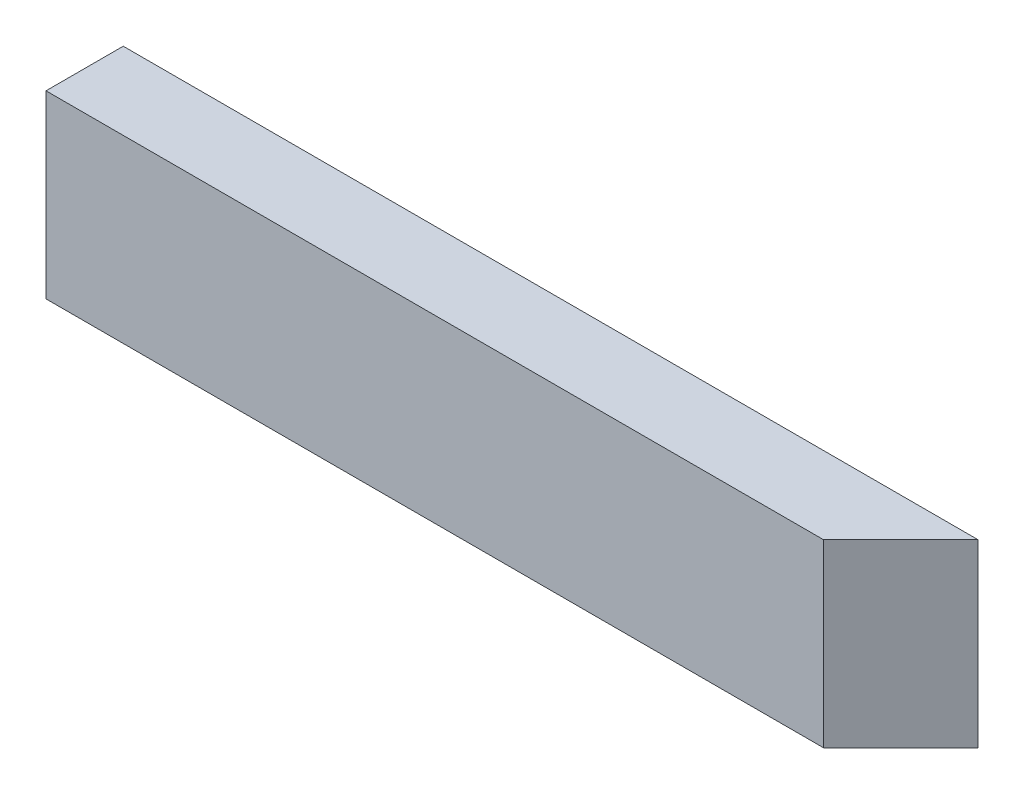
ISO-10303-21;
HEADER;
FILE_DESCRIPTION(('STEP AP214'),'2;1');
FILE_NAME('part.step','',(''),(''),'','','');
FILE_SCHEMA(('AUTOMOTIVE_DESIGN { 1 0 10303 214 1 1 1 1 }'));
ENDSEC;
DATA;
#1=APPLICATION_CONTEXT('core data for automotive mechanical design processes');
#2=APPLICATION_PROTOCOL_DEFINITION('international standard','automotive_design',2000,#1);
#3=PRODUCT_CONTEXT('',#1,'mechanical');
#4=PRODUCT('Part','Part','',(#3));
#5=PRODUCT_RELATED_PRODUCT_CATEGORY('part','',(#4));
#6=PRODUCT_DEFINITION_FORMATION('','',#4);
#7=PRODUCT_DEFINITION_CONTEXT('part definition',#1,'design');
#8=PRODUCT_DEFINITION('design','',#6,#7);
#9=PRODUCT_DEFINITION_SHAPE('','',#8);
#10=(LENGTH_UNIT() NAMED_UNIT(*) SI_UNIT(.MILLI.,.METRE.));
#11=(NAMED_UNIT(*) PLANE_ANGLE_UNIT() SI_UNIT($,.RADIAN.));
#12=(NAMED_UNIT(*) SI_UNIT($,.STERADIAN.) SOLID_ANGLE_UNIT());
#13=UNCERTAINTY_MEASURE_WITH_UNIT(LENGTH_MEASURE(1.E-05),#10,'distance_accuracy_value','');
#14=(GEOMETRIC_REPRESENTATION_CONTEXT(3) GLOBAL_UNCERTAINTY_ASSIGNED_CONTEXT((#13)) GLOBAL_UNIT_ASSIGNED_CONTEXT((#10,
#11,#12)) REPRESENTATION_CONTEXT('',''));
#15=CARTESIAN_POINT('',(0.,0.,0.));
#16=DIRECTION('',(0.,0.,1.));
#17=DIRECTION('',(1.,0.,0.));
#18=AXIS2_PLACEMENT_3D('',#15,#16,#17);
#19=CARTESIAN_POINT('',(0.,88.9,0.));
#20=DIRECTION('',(1.,0.,0.));
#21=DIRECTION('',(0.,0.,-1.));
#22=AXIS2_PLACEMENT_3D('',#19,#20,#21);
#23=PLANE('',#22);
#24=DIRECTION('',(0.,0.,1.));
#25=VECTOR('',#24,1.);
#26=CARTESIAN_POINT('',(0.,0.,0.));
#27=LINE('',#26,#25);
#28=CARTESIAN_POINT('',(0.,0.,-38.1));
#29=VERTEX_POINT('',#28);
#30=CARTESIAN_POINT('',(0.,0.,0.));
#31=VERTEX_POINT('',#30);
#32=EDGE_CURVE('E100',#29,#31,#27,.T.);
#33=ORIENTED_EDGE('',*,*,#32,.T.);
#34=DIRECTION('',(0.,-1.,0.));
#35=VECTOR('',#34,1.);
#36=CARTESIAN_POINT('',(0.,88.9,0.));
#37=LINE('',#36,#35);
#38=CARTESIAN_POINT('',(0.,88.9,0.));
#39=VERTEX_POINT('',#38);
#40=EDGE_CURVE('E11',#39,#31,#37,.T.);
#41=ORIENTED_EDGE('',*,*,#40,.F.);
#42=DIRECTION('',(0.,0.,1.));
#43=VECTOR('',#42,1.);
#44=CARTESIAN_POINT('',(0.,88.9,0.));
#45=LINE('',#44,#43);
#46=CARTESIAN_POINT('',(0.,88.9,-38.1));
#47=VERTEX_POINT('',#46);
#48=EDGE_CURVE('E88',#47,#39,#45,.T.);
#49=ORIENTED_EDGE('',*,*,#48,.F.);
#50=DIRECTION('',(0.,-1.,0.));
#51=VECTOR('',#50,1.);
#52=CARTESIAN_POINT('',(0.,88.9,-38.1));
#53=LINE('',#52,#51);
#54=EDGE_CURVE('E96',#47,#29,#53,.T.);
#55=ORIENTED_EDGE('',*,*,#54,.T.);
#56=EDGE_LOOP('',(#33,#41,#49,#55));
#57=FACE_BOUND('',#56,.T.);
#58=ADVANCED_FACE('F37',(#57),#23,.F.);
#59=CARTESIAN_POINT('',(0.,88.9,0.));
#60=DIRECTION('',(0.,0.,-1.));
#61=DIRECTION('',(-1.,0.,0.));
#62=AXIS2_PLACEMENT_3D('',#59,#60,#61);
#63=PLANE('',#62);
#64=DIRECTION('',(1.,0.,0.));
#65=VECTOR('',#64,1.);
#66=CARTESIAN_POINT('',(0.,0.,0.));
#67=LINE('',#66,#65);
#68=CARTESIAN_POINT('',(383.540000000001,0.,0.));
#69=VERTEX_POINT('',#68);
#70=EDGE_CURVE('E92',#31,#69,#67,.T.);
#71=ORIENTED_EDGE('',*,*,#70,.T.);
#72=DIRECTION('',(0.,-1.,0.));
#73=VECTOR('',#72,1.);
#74=CARTESIAN_POINT('',(383.540000000001,88.9,0.));
#75=LINE('',#74,#73);
#76=CARTESIAN_POINT('',(383.540000000001,88.9,0.));
#77=VERTEX_POINT('',#76);
#78=EDGE_CURVE('E45',#77,#69,#75,.T.);
#79=ORIENTED_EDGE('',*,*,#78,.F.);
#80=DIRECTION('',(1.,0.,0.));
#81=VECTOR('',#80,1.);
#82=CARTESIAN_POINT('',(0.,88.9,0.));
#83=LINE('',#82,#81);
#84=EDGE_CURVE('E83',#39,#77,#83,.T.);
#85=ORIENTED_EDGE('',*,*,#84,.F.);
#86=ORIENTED_EDGE('',*,*,#40,.T.);
#87=EDGE_LOOP('',(#71,#79,#85,#86));
#88=FACE_BOUND('',#87,.T.);
#89=ADVANCED_FACE('F91',(#88),#63,.F.);
#90=CARTESIAN_POINT('',(421.64,88.9,-38.1));
#91=DIRECTION('',(-0.707106781186554,0.,-0.707106781186541));
#92=DIRECTION('',(-0.707106781186541,0.,0.707106781186554));
#93=AXIS2_PLACEMENT_3D('',#90,#91,#92);
#94=PLANE('',#93);
#95=DIRECTION('',(0.707106781186541,0.,-0.707106781186554));
#96=VECTOR('',#95,1.);
#97=CARTESIAN_POINT('',(421.64,0.,-38.1));
#98=LINE('',#97,#96);
#99=CARTESIAN_POINT('',(421.64,0.,-38.1));
#100=VERTEX_POINT('',#99);
#101=EDGE_CURVE('E70',#69,#100,#98,.T.);
#102=ORIENTED_EDGE('',*,*,#101,.T.);
#103=DIRECTION('',(0.,-1.,0.));
#104=VECTOR('',#103,1.);
#105=CARTESIAN_POINT('',(421.64,88.9,-38.1));
#106=LINE('',#105,#104);
#107=CARTESIAN_POINT('',(421.64,88.9,-38.1));
#108=VERTEX_POINT('',#107);
#109=EDGE_CURVE('E93',#108,#100,#106,.T.);
#110=ORIENTED_EDGE('',*,*,#109,.F.);
#111=DIRECTION('',(0.707106781186541,0.,-0.707106781186554));
#112=VECTOR('',#111,1.);
#113=CARTESIAN_POINT('',(421.64,88.9,-38.1));
#114=LINE('',#113,#112);
#115=EDGE_CURVE('E86',#77,#108,#114,.T.);
#116=ORIENTED_EDGE('',*,*,#115,.F.);
#117=ORIENTED_EDGE('',*,*,#78,.T.);
#118=EDGE_LOOP('',(#102,#110,#116,#117));
#119=FACE_BOUND('',#118,.T.);
#120=ADVANCED_FACE('F94',(#119),#94,.F.);
#121=CARTESIAN_POINT('',(0.,88.9,-38.1));
#122=DIRECTION('',(0.,0.,1.));
#123=DIRECTION('',(1.,0.,0.));
#124=AXIS2_PLACEMENT_3D('',#121,#122,#123);
#125=PLANE('',#124);
#126=DIRECTION('',(-1.,0.,0.));
#127=VECTOR('',#126,1.);
#128=CARTESIAN_POINT('',(0.,0.,-38.1));
#129=LINE('',#128,#127);
#130=EDGE_CURVE('E76',#100,#29,#129,.T.);
#131=ORIENTED_EDGE('',*,*,#130,.T.);
#132=ORIENTED_EDGE('',*,*,#54,.F.);
#133=DIRECTION('',(-1.,0.,0.));
#134=VECTOR('',#133,1.);
#135=CARTESIAN_POINT('',(0.,88.9,-38.1));
#136=LINE('',#135,#134);
#137=EDGE_CURVE('E53',#108,#47,#136,.T.);
#138=ORIENTED_EDGE('',*,*,#137,.F.);
#139=ORIENTED_EDGE('',*,*,#109,.T.);
#140=EDGE_LOOP('',(#131,#132,#138,#139));
#141=FACE_BOUND('',#140,.T.);
#142=ADVANCED_FACE('F107',(#141),#125,.F.);
#143=CARTESIAN_POINT('',(0.,88.9,0.));
#144=DIRECTION('',(0.,-1.,0.));
#145=DIRECTION('',(0.,0.,-1.));
#146=AXIS2_PLACEMENT_3D('',#143,#144,#145);
#147=PLANE('',#146);
#148=ORIENTED_EDGE('',*,*,#48,.T.);
#149=ORIENTED_EDGE('',*,*,#84,.T.);
#150=ORIENTED_EDGE('',*,*,#115,.T.);
#151=ORIENTED_EDGE('',*,*,#137,.T.);
#152=EDGE_LOOP('',(#148,#149,#150,#151));
#153=FACE_BOUND('',#152,.T.);
#154=ADVANCED_FACE('F84',(#153),#147,.F.);
#155=CARTESIAN_POINT('',(0.,0.,0.));
#156=DIRECTION('',(0.,-1.,0.));
#157=DIRECTION('',(0.,0.,-1.));
#158=AXIS2_PLACEMENT_3D('',#155,#156,#157);
#159=PLANE('',#158);
#160=ORIENTED_EDGE('',*,*,#32,.F.);
#161=ORIENTED_EDGE('',*,*,#130,.F.);
#162=ORIENTED_EDGE('',*,*,#101,.F.);
#163=ORIENTED_EDGE('',*,*,#70,.F.);
#164=EDGE_LOOP('',(#160,#161,#162,#163));
#165=FACE_BOUND('',#164,.T.);
#166=ADVANCED_FACE('F110',(#165),#159,.T.);
#167=CLOSED_SHELL('',(#58,#89,#120,#142,#154,#166));
#168=MANIFOLD_SOLID_BREP('B2',#167);
#169=ADVANCED_BREP_SHAPE_REPRESENTATION('',(#18,#168),#14);
#170=SHAPE_DEFINITION_REPRESENTATION(#9,#169);
ENDSEC;
END-ISO-10303-21;
